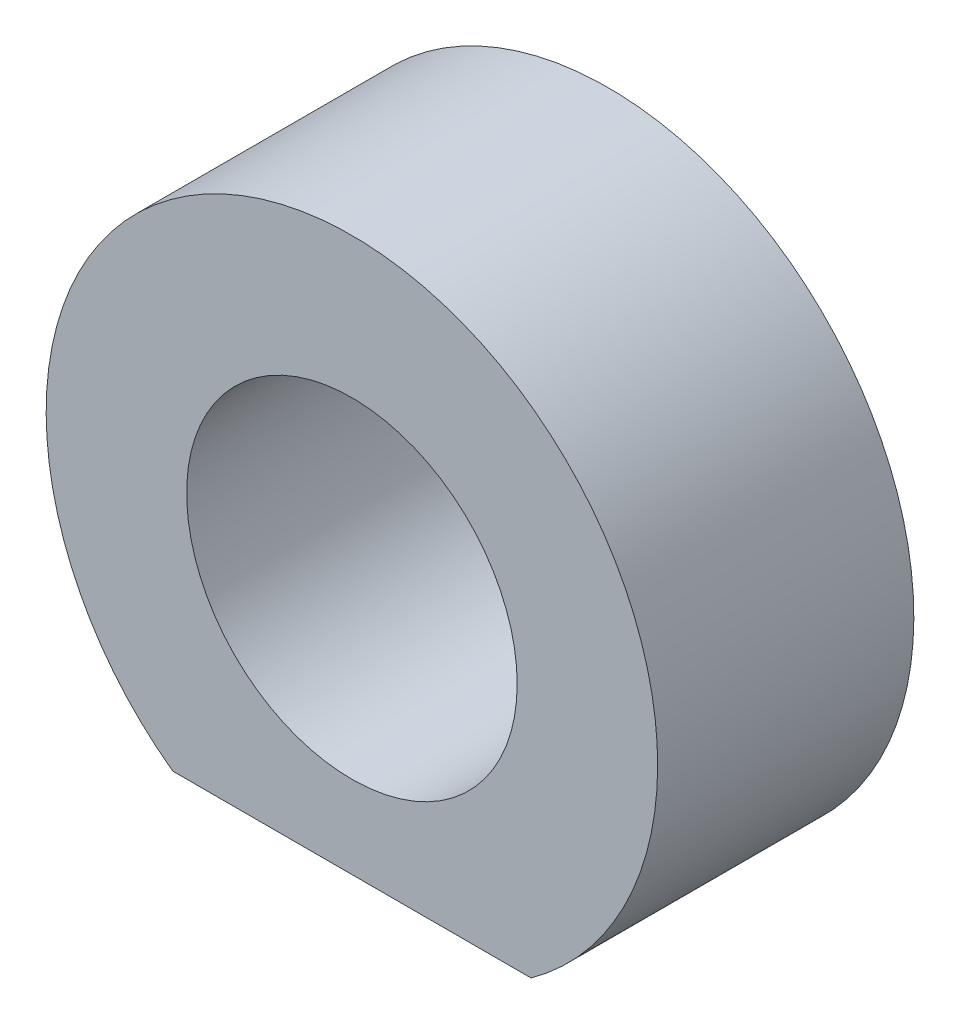
ISO-10303-21;
HEADER;
FILE_DESCRIPTION(('STEP AP214'),'2;1');
FILE_NAME('part.step','',(''),(''),'','','');
FILE_SCHEMA(('AUTOMOTIVE_DESIGN { 1 0 10303 214 1 1 1 1 }'));
ENDSEC;
DATA;
#1=APPLICATION_CONTEXT('core data for automotive mechanical design processes');
#2=APPLICATION_PROTOCOL_DEFINITION('international standard','automotive_design',2000,#1);
#3=PRODUCT_CONTEXT('',#1,'mechanical');
#4=PRODUCT('Part','Part','',(#3));
#5=PRODUCT_RELATED_PRODUCT_CATEGORY('part','',(#4));
#6=PRODUCT_DEFINITION_FORMATION('','',#4);
#7=PRODUCT_DEFINITION_CONTEXT('part definition',#1,'design');
#8=PRODUCT_DEFINITION('design','',#6,#7);
#9=PRODUCT_DEFINITION_SHAPE('','',#8);
#10=(LENGTH_UNIT() NAMED_UNIT(*) SI_UNIT(.MILLI.,.METRE.));
#11=(NAMED_UNIT(*) PLANE_ANGLE_UNIT() SI_UNIT($,.RADIAN.));
#12=(NAMED_UNIT(*) SI_UNIT($,.STERADIAN.) SOLID_ANGLE_UNIT());
#13=UNCERTAINTY_MEASURE_WITH_UNIT(LENGTH_MEASURE(1.E-05),#10,'distance_accuracy_value','');
#14=(GEOMETRIC_REPRESENTATION_CONTEXT(3) GLOBAL_UNCERTAINTY_ASSIGNED_CONTEXT((#13)) GLOBAL_UNIT_ASSIGNED_CONTEXT((#10,
#11,#12)) REPRESENTATION_CONTEXT('',''));
#15=CARTESIAN_POINT('',(0.,0.,0.));
#16=DIRECTION('',(0.,0.,1.));
#17=DIRECTION('',(1.,0.,0.));
#18=AXIS2_PLACEMENT_3D('',#15,#16,#17);
#19=CARTESIAN_POINT('',(0.,0.,15.5));
#20=DIRECTION('',(0.,0.,1.));
#21=DIRECTION('',(1.,0.,0.));
#22=AXIS2_PLACEMENT_3D('',#19,#20,#21);
#23=PLANE('',#22);
#24=CARTESIAN_POINT('',(0.,0.,15.5));
#25=DIRECTION('',(0.,0.,1.));
#26=DIRECTION('',(1.,0.,0.));
#27=AXIS2_PLACEMENT_3D('',#24,#25,#26);
#28=CIRCLE('',#27,18.5);
#29=CARTESIAN_POINT('',(10.84,-14.9914775789446,15.5));
#30=VERTEX_POINT('',#29);
#31=CARTESIAN_POINT('',(-10.84,-14.9914775789446,15.5));
#32=VERTEX_POINT('',#31);
#33=EDGE_CURVE('E90',#30,#32,#28,.T.);
#34=ORIENTED_EDGE('',*,*,#33,.T.);
#35=DIRECTION('',(1.,0.,0.));
#36=VECTOR('',#35,1.);
#37=CARTESIAN_POINT('',(-10.84,-14.9914775789446,15.5));
#38=LINE('',#37,#36);
#39=EDGE_CURVE('E53',#32,#30,#38,.T.);
#40=ORIENTED_EDGE('',*,*,#39,.T.);
#41=EDGE_LOOP('',(#34,#40));
#42=FACE_BOUND('',#41,.T.);
#43=CARTESIAN_POINT('',(0.,0.,15.5));
#44=DIRECTION('',(0.,0.,1.));
#45=DIRECTION('',(1.,0.,0.));
#46=AXIS2_PLACEMENT_3D('',#43,#44,#45);
#47=CIRCLE('',#46,10.);
#48=CARTESIAN_POINT('',(10.,0.,15.5));
#49=VERTEX_POINT('',#48);
#50=EDGE_CURVE('E80',#49,#49,#47,.T.);
#51=ORIENTED_EDGE('',*,*,#50,.F.);
#52=EDGE_LOOP('',(#51));
#53=FACE_BOUND('',#52,.T.);
#54=ADVANCED_FACE('F37',(#42,#53),#23,.T.);
#55=CARTESIAN_POINT('',(0.,0.,0.));
#56=DIRECTION('',(0.,0.,1.));
#57=DIRECTION('',(1.,0.,0.));
#58=AXIS2_PLACEMENT_3D('',#55,#56,#57);
#59=PLANE('',#58);
#60=CARTESIAN_POINT('',(0.,0.,0.));
#61=DIRECTION('',(0.,0.,1.));
#62=DIRECTION('',(1.,0.,0.));
#63=AXIS2_PLACEMENT_3D('',#60,#61,#62);
#64=CIRCLE('',#63,18.5);
#65=CARTESIAN_POINT('',(10.84,-14.9914775789446,0.));
#66=VERTEX_POINT('',#65);
#67=CARTESIAN_POINT('',(-10.84,-14.9914775789446,0.));
#68=VERTEX_POINT('',#67);
#69=EDGE_CURVE('E88',#66,#68,#64,.T.);
#70=ORIENTED_EDGE('',*,*,#69,.F.);
#71=DIRECTION('',(1.,0.,0.));
#72=VECTOR('',#71,1.);
#73=CARTESIAN_POINT('',(-10.84,-14.9914775789446,0.));
#74=LINE('',#73,#72);
#75=EDGE_CURVE('E63',#68,#66,#74,.T.);
#76=ORIENTED_EDGE('',*,*,#75,.F.);
#77=EDGE_LOOP('',(#70,#76));
#78=FACE_BOUND('',#77,.T.);
#79=CARTESIAN_POINT('',(0.,0.,0.));
#80=DIRECTION('',(0.,0.,1.));
#81=DIRECTION('',(1.,0.,0.));
#82=AXIS2_PLACEMENT_3D('',#79,#80,#81);
#83=CIRCLE('',#82,10.);
#84=CARTESIAN_POINT('',(10.,0.,0.));
#85=VERTEX_POINT('',#84);
#86=EDGE_CURVE('E76',#85,#85,#83,.T.);
#87=ORIENTED_EDGE('',*,*,#86,.T.);
#88=EDGE_LOOP('',(#87));
#89=FACE_BOUND('',#88,.T.);
#90=ADVANCED_FACE('F100',(#78,#89),#59,.F.);
#91=CARTESIAN_POINT('',(0.,0.,15.5));
#92=DIRECTION('',(0.,0.,-1.));
#93=DIRECTION('',(-1.,0.,0.));
#94=AXIS2_PLACEMENT_3D('',#91,#92,#93);
#95=CYLINDRICAL_SURFACE('',#94,18.5);
#96=ORIENTED_EDGE('',*,*,#69,.T.);
#97=DIRECTION('',(0.,0.,-1.));
#98=VECTOR('',#97,1.);
#99=CARTESIAN_POINT('',(-10.84,-14.9914775789446,15.5));
#100=LINE('',#99,#98);
#101=EDGE_CURVE('E11',#32,#68,#100,.T.);
#102=ORIENTED_EDGE('',*,*,#101,.F.);
#103=ORIENTED_EDGE('',*,*,#33,.F.);
#104=DIRECTION('',(0.,0.,-1.));
#105=VECTOR('',#104,1.);
#106=CARTESIAN_POINT('',(10.84,-14.9914775789446,15.5));
#107=LINE('',#106,#105);
#108=EDGE_CURVE('E46',#30,#66,#107,.T.);
#109=ORIENTED_EDGE('',*,*,#108,.T.);
#110=EDGE_LOOP('',(#96,#102,#103,#109));
#111=FACE_BOUND('',#110,.T.);
#112=ADVANCED_FACE('F39',(#111),#95,.T.);
#113=CARTESIAN_POINT('',(-10.84,-14.9914775789446,15.5));
#114=DIRECTION('',(0.,1.,0.));
#115=DIRECTION('',(-1.,0.,0.));
#116=AXIS2_PLACEMENT_3D('',#113,#114,#115);
#117=PLANE('',#116);
#118=CARTESIAN_POINT('',(0.,-14.9914775789446,7.75));
#119=DIRECTION('',(0.,-1.,0.));
#120=DIRECTION('',(0.,0.,-1.));
#121=AXIS2_PLACEMENT_3D('',#118,#119,#120);
#122=CIRCLE('',#121,1.025);
#123=CARTESIAN_POINT('',(0.,-14.9914775789446,6.725));
#124=VERTEX_POINT('',#123);
#125=EDGE_CURVE('E83',#124,#124,#122,.T.);
#126=ORIENTED_EDGE('',*,*,#125,.F.);
#127=EDGE_LOOP('',(#126));
#128=FACE_BOUND('',#127,.T.);
#129=ORIENTED_EDGE('',*,*,#75,.T.);
#130=ORIENTED_EDGE('',*,*,#108,.F.);
#131=ORIENTED_EDGE('',*,*,#39,.F.);
#132=ORIENTED_EDGE('',*,*,#101,.T.);
#133=EDGE_LOOP('',(#129,#130,#131,#132));
#134=FACE_BOUND('',#133,.T.);
#135=ADVANCED_FACE('F107',(#128,#134),#117,.F.);
#136=CARTESIAN_POINT('',(0.,0.,15.5));
#137=DIRECTION('',(0.,0.,-1.));
#138=DIRECTION('',(-1.,0.,0.));
#139=AXIS2_PLACEMENT_3D('',#136,#137,#138);
#140=CYLINDRICAL_SURFACE('',#139,10.);
#141=ORIENTED_EDGE('',*,*,#50,.T.);
#142=EDGE_LOOP('',(#141));
#143=FACE_BOUND('',#142,.T.);
#144=ORIENTED_EDGE('',*,*,#86,.F.);
#145=EDGE_LOOP('',(#144));
#146=FACE_BOUND('',#145,.T.);
#147=ADVANCED_FACE('F70',(#143,#146),#140,.F.);
#148=CARTESIAN_POINT('',(0.,-12.9914775789446,7.75));
#149=DIRECTION('',(0.,-1.,0.));
#150=DIRECTION('',(0.,0.,-1.));
#151=AXIS2_PLACEMENT_3D('',#148,#149,#150);
#152=CONICAL_SURFACE('',#151,0.999999999999999,1.02974425867665);
#153=CARTESIAN_POINT('',(0.,-12.3906169599171,7.75));
#154=VERTEX_POINT('',#153);
#155=VERTEX_LOOP('',#154);
#156=FACE_BOUND('',#155,.T.);
#157=CARTESIAN_POINT('',(0.,-12.9914775789446,7.75));
#158=DIRECTION('',(0.,-1.,0.));
#159=DIRECTION('',(0.,0.,-1.));
#160=AXIS2_PLACEMENT_3D('',#157,#158,#159);
#161=CIRCLE('',#160,0.999999999999999);
#162=CARTESIAN_POINT('',(0.,-12.9914775789446,6.75));
#163=VERTEX_POINT('',#162);
#164=EDGE_CURVE('E74',#163,#163,#161,.T.);
#165=ORIENTED_EDGE('',*,*,#164,.T.);
#166=EDGE_LOOP('',(#165));
#167=FACE_BOUND('',#166,.T.);
#168=ADVANCED_FACE('F66',(#156,#167),#152,.F.);
#169=CARTESIAN_POINT('',(0.,-14.9914775789446,7.75));
#170=DIRECTION('',(0.,-1.,0.));
#171=DIRECTION('',(0.,0.,-1.));
#172=AXIS2_PLACEMENT_3D('',#169,#170,#171);
#173=CYLINDRICAL_SURFACE('',#172,1.);
#174=ORIENTED_EDGE('',*,*,#164,.F.);
#175=EDGE_LOOP('',(#174));
#176=FACE_BOUND('',#175,.T.);
#177=CARTESIAN_POINT('',(0.,-14.9664775789446,7.75));
#178=DIRECTION('',(0.,-1.,0.));
#179=DIRECTION('',(0.,0.,-1.));
#180=AXIS2_PLACEMENT_3D('',#177,#178,#179);
#181=CIRCLE('',#180,1.);
#182=CARTESIAN_POINT('',(0.,-14.9664775789446,6.75));
#183=VERTEX_POINT('',#182);
#184=EDGE_CURVE('E77',#183,#183,#181,.T.);
#185=ORIENTED_EDGE('',*,*,#184,.T.);
#186=EDGE_LOOP('',(#185));
#187=FACE_BOUND('',#186,.T.);
#188=ADVANCED_FACE('F69',(#176,#187),#173,.F.);
#189=CARTESIAN_POINT('',(0.,-14.9914775789446,7.75));
#190=DIRECTION('',(0.,-1.,0.));
#191=DIRECTION('',(0.,0.,-1.));
#192=AXIS2_PLACEMENT_3D('',#189,#190,#191);
#193=CONICAL_SURFACE('',#192,1.025,0.785398163397474);
#194=ORIENTED_EDGE('',*,*,#184,.F.);
#195=EDGE_LOOP('',(#194));
#196=FACE_BOUND('',#195,.T.);
#197=ORIENTED_EDGE('',*,*,#125,.T.);
#198=EDGE_LOOP('',(#197));
#199=FACE_BOUND('',#198,.T.);
#200=ADVANCED_FACE('F150',(#196,#199),#193,.F.);
#201=CLOSED_SHELL('',(#54,#90,#112,#135,#147,#168,#188,#200));
#202=MANIFOLD_SOLID_BREP('B2',#201);
#203=ADVANCED_BREP_SHAPE_REPRESENTATION('',(#18,#202),#14);
#204=SHAPE_DEFINITION_REPRESENTATION(#9,#203);
ENDSEC;
END-ISO-10303-21;
